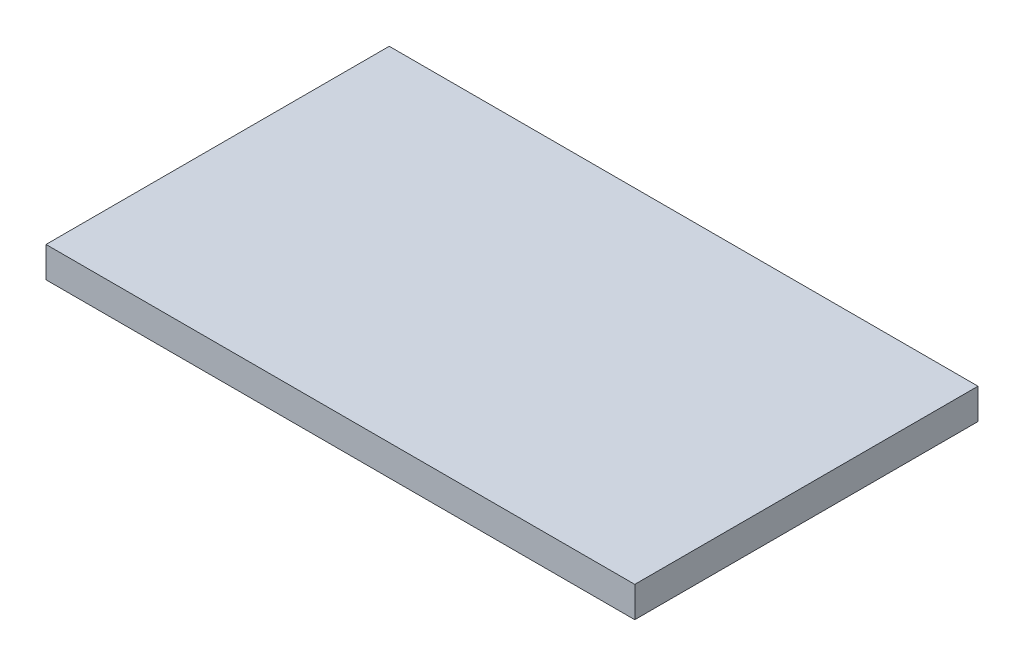
ISO-10303-21;
HEADER;
FILE_DESCRIPTION(('STEP AP214'),'2;1');
FILE_NAME('part.step','',(''),(''),'','','');
FILE_SCHEMA(('AUTOMOTIVE_DESIGN { 1 0 10303 214 1 1 1 1 }'));
ENDSEC;
DATA;
#1=APPLICATION_CONTEXT('core data for automotive mechanical design processes');
#2=APPLICATION_PROTOCOL_DEFINITION('international standard','automotive_design',2000,#1);
#3=PRODUCT_CONTEXT('',#1,'mechanical');
#4=PRODUCT('Part','Part','',(#3));
#5=PRODUCT_RELATED_PRODUCT_CATEGORY('part','',(#4));
#6=PRODUCT_DEFINITION_FORMATION('','',#4);
#7=PRODUCT_DEFINITION_CONTEXT('part definition',#1,'design');
#8=PRODUCT_DEFINITION('design','',#6,#7);
#9=PRODUCT_DEFINITION_SHAPE('','',#8);
#10=(LENGTH_UNIT() NAMED_UNIT(*) SI_UNIT(.MILLI.,.METRE.));
#11=(NAMED_UNIT(*) PLANE_ANGLE_UNIT() SI_UNIT($,.RADIAN.));
#12=(NAMED_UNIT(*) SI_UNIT($,.STERADIAN.) SOLID_ANGLE_UNIT());
#13=UNCERTAINTY_MEASURE_WITH_UNIT(LENGTH_MEASURE(1.E-05),#10,'distance_accuracy_value','');
#14=(GEOMETRIC_REPRESENTATION_CONTEXT(3) GLOBAL_UNCERTAINTY_ASSIGNED_CONTEXT((#13)) GLOBAL_UNIT_ASSIGNED_CONTEXT((#10,
#11,#12)) REPRESENTATION_CONTEXT('',''));
#15=CARTESIAN_POINT('',(0.,0.,0.));
#16=DIRECTION('',(0.,0.,1.));
#17=DIRECTION('',(1.,0.,0.));
#18=AXIS2_PLACEMENT_3D('',#15,#16,#17);
#19=CARTESIAN_POINT('',(0.,2.,0.));
#20=DIRECTION('',(1.,0.,0.));
#21=DIRECTION('',(0.,0.,-1.));
#22=AXIS2_PLACEMENT_3D('',#19,#20,#21);
#23=PLANE('',#22);
#24=DIRECTION('',(0.,0.,1.));
#25=VECTOR('',#24,1.);
#26=CARTESIAN_POINT('',(0.,0.,0.));
#27=LINE('',#26,#25);
#28=CARTESIAN_POINT('',(0.,0.,0.));
#29=VERTEX_POINT('',#28);
#30=CARTESIAN_POINT('',(0.,0.,22.41));
#31=VERTEX_POINT('',#30);
#32=EDGE_CURVE('E113',#29,#31,#27,.T.);
#33=ORIENTED_EDGE('',*,*,#32,.T.);
#34=DIRECTION('',(0.,-1.,0.));
#35=VECTOR('',#34,1.);
#36=CARTESIAN_POINT('',(0.,2.,22.41));
#37=LINE('',#36,#35);
#38=CARTESIAN_POINT('',(0.,2.,22.41));
#39=VERTEX_POINT('',#38);
#40=EDGE_CURVE('E11',#39,#31,#37,.T.);
#41=ORIENTED_EDGE('',*,*,#40,.F.);
#42=DIRECTION('',(0.,0.,1.));
#43=VECTOR('',#42,1.);
#44=CARTESIAN_POINT('',(0.,2.,0.));
#45=LINE('',#44,#43);
#46=CARTESIAN_POINT('',(0.,2.,0.));
#47=VERTEX_POINT('',#46);
#48=EDGE_CURVE('E97',#47,#39,#45,.T.);
#49=ORIENTED_EDGE('',*,*,#48,.F.);
#50=DIRECTION('',(0.,-1.,0.));
#51=VECTOR('',#50,1.);
#52=CARTESIAN_POINT('',(0.,2.,0.));
#53=LINE('',#52,#51);
#54=EDGE_CURVE('E109',#47,#29,#53,.T.);
#55=ORIENTED_EDGE('',*,*,#54,.T.);
#56=EDGE_LOOP('',(#33,#41,#49,#55));
#57=FACE_BOUND('',#56,.T.);
#58=ADVANCED_FACE('F45',(#57),#23,.F.);
#59=CARTESIAN_POINT('',(0.,2.,22.41));
#60=DIRECTION('',(0.,0.,-1.));
#61=DIRECTION('',(-1.,0.,0.));
#62=AXIS2_PLACEMENT_3D('',#59,#60,#61);
#63=PLANE('',#62);
#64=DIRECTION('',(1.,0.,0.));
#65=VECTOR('',#64,1.);
#66=CARTESIAN_POINT('',(0.,0.,22.41));
#67=LINE('',#66,#65);
#68=CARTESIAN_POINT('',(38.44,0.,22.41));
#69=VERTEX_POINT('',#68);
#70=EDGE_CURVE('E102',#31,#69,#67,.T.);
#71=ORIENTED_EDGE('',*,*,#70,.T.);
#72=DIRECTION('',(0.,-1.,0.));
#73=VECTOR('',#72,1.);
#74=CARTESIAN_POINT('',(38.44,2.,22.41));
#75=LINE('',#74,#73);
#76=CARTESIAN_POINT('',(38.44,2.,22.41));
#77=VERTEX_POINT('',#76);
#78=EDGE_CURVE('E54',#77,#69,#75,.T.);
#79=ORIENTED_EDGE('',*,*,#78,.F.);
#80=DIRECTION('',(1.,0.,0.));
#81=VECTOR('',#80,1.);
#82=CARTESIAN_POINT('',(0.,2.,22.41));
#83=LINE('',#82,#81);
#84=EDGE_CURVE('E92',#39,#77,#83,.T.);
#85=ORIENTED_EDGE('',*,*,#84,.F.);
#86=ORIENTED_EDGE('',*,*,#40,.T.);
#87=EDGE_LOOP('',(#71,#79,#85,#86));
#88=FACE_BOUND('',#87,.T.);
#89=ADVANCED_FACE('F101',(#88),#63,.F.);
#90=CARTESIAN_POINT('',(38.44,2.,0.));
#91=DIRECTION('',(-1.,0.,0.));
#92=DIRECTION('',(0.,0.,1.));
#93=AXIS2_PLACEMENT_3D('',#90,#91,#92);
#94=PLANE('',#93);
#95=DIRECTION('',(0.,0.,-1.));
#96=VECTOR('',#95,1.);
#97=CARTESIAN_POINT('',(38.44,0.,0.));
#98=LINE('',#97,#96);
#99=CARTESIAN_POINT('',(38.44,0.,0.));
#100=VERTEX_POINT('',#99);
#101=EDGE_CURVE('E79',#69,#100,#98,.T.);
#102=ORIENTED_EDGE('',*,*,#101,.T.);
#103=DIRECTION('',(0.,-1.,0.));
#104=VECTOR('',#103,1.);
#105=CARTESIAN_POINT('',(38.44,2.,0.));
#106=LINE('',#105,#104);
#107=CARTESIAN_POINT('',(38.44,2.,0.));
#108=VERTEX_POINT('',#107);
#109=EDGE_CURVE('E104',#108,#100,#106,.T.);
#110=ORIENTED_EDGE('',*,*,#109,.F.);
#111=DIRECTION('',(0.,0.,-1.));
#112=VECTOR('',#111,1.);
#113=CARTESIAN_POINT('',(38.44,2.,0.));
#114=LINE('',#113,#112);
#115=EDGE_CURVE('E95',#77,#108,#114,.T.);
#116=ORIENTED_EDGE('',*,*,#115,.F.);
#117=ORIENTED_EDGE('',*,*,#78,.T.);
#118=EDGE_LOOP('',(#102,#110,#116,#117));
#119=FACE_BOUND('',#118,.T.);
#120=ADVANCED_FACE('F105',(#119),#94,.F.);
#121=CARTESIAN_POINT('',(0.,2.,0.));
#122=DIRECTION('',(0.,0.,1.));
#123=DIRECTION('',(1.,0.,0.));
#124=AXIS2_PLACEMENT_3D('',#121,#122,#123);
#125=PLANE('',#124);
#126=DIRECTION('',(-1.,0.,0.));
#127=VECTOR('',#126,1.);
#128=CARTESIAN_POINT('',(0.,0.,0.));
#129=LINE('',#128,#127);
#130=EDGE_CURVE('E85',#100,#29,#129,.T.);
#131=ORIENTED_EDGE('',*,*,#130,.T.);
#132=ORIENTED_EDGE('',*,*,#54,.F.);
#133=DIRECTION('',(-1.,0.,0.));
#134=VECTOR('',#133,1.);
#135=CARTESIAN_POINT('',(0.,2.,0.));
#136=LINE('',#135,#134);
#137=EDGE_CURVE('E62',#108,#47,#136,.T.);
#138=ORIENTED_EDGE('',*,*,#137,.F.);
#139=ORIENTED_EDGE('',*,*,#109,.T.);
#140=EDGE_LOOP('',(#131,#132,#138,#139));
#141=FACE_BOUND('',#140,.T.);
#142=ADVANCED_FACE('F126',(#141),#125,.F.);
#143=CARTESIAN_POINT('',(0.,2.,0.));
#144=DIRECTION('',(0.,1.,0.));
#145=DIRECTION('',(0.,0.,1.));
#146=AXIS2_PLACEMENT_3D('',#143,#144,#145);
#147=PLANE('',#146);
#148=ORIENTED_EDGE('',*,*,#48,.T.);
#149=ORIENTED_EDGE('',*,*,#84,.T.);
#150=ORIENTED_EDGE('',*,*,#115,.T.);
#151=ORIENTED_EDGE('',*,*,#137,.T.);
#152=EDGE_LOOP('',(#148,#149,#150,#151));
#153=FACE_BOUND('',#152,.T.);
#154=ADVANCED_FACE('F93',(#153),#147,.T.);
#155=CARTESIAN_POINT('',(0.,0.,0.));
#156=DIRECTION('',(0.,1.,0.));
#157=DIRECTION('',(0.,0.,1.));
#158=AXIS2_PLACEMENT_3D('',#155,#156,#157);
#159=PLANE('',#158);
#160=ORIENTED_EDGE('',*,*,#32,.F.);
#161=ORIENTED_EDGE('',*,*,#130,.F.);
#162=ORIENTED_EDGE('',*,*,#101,.F.);
#163=ORIENTED_EDGE('',*,*,#70,.F.);
#164=EDGE_LOOP('',(#160,#161,#162,#163));
#165=FACE_BOUND('',#164,.T.);
#166=ADVANCED_FACE('F129',(#165),#159,.F.);
#167=CLOSED_SHELL('',(#58,#89,#120,#142,#154,#166));
#168=MANIFOLD_SOLID_BREP('B2',#167);
#169=ADVANCED_BREP_SHAPE_REPRESENTATION('',(#18,#168),#14);
#170=SHAPE_DEFINITION_REPRESENTATION(#9,#169);
ENDSEC;
END-ISO-10303-21;
